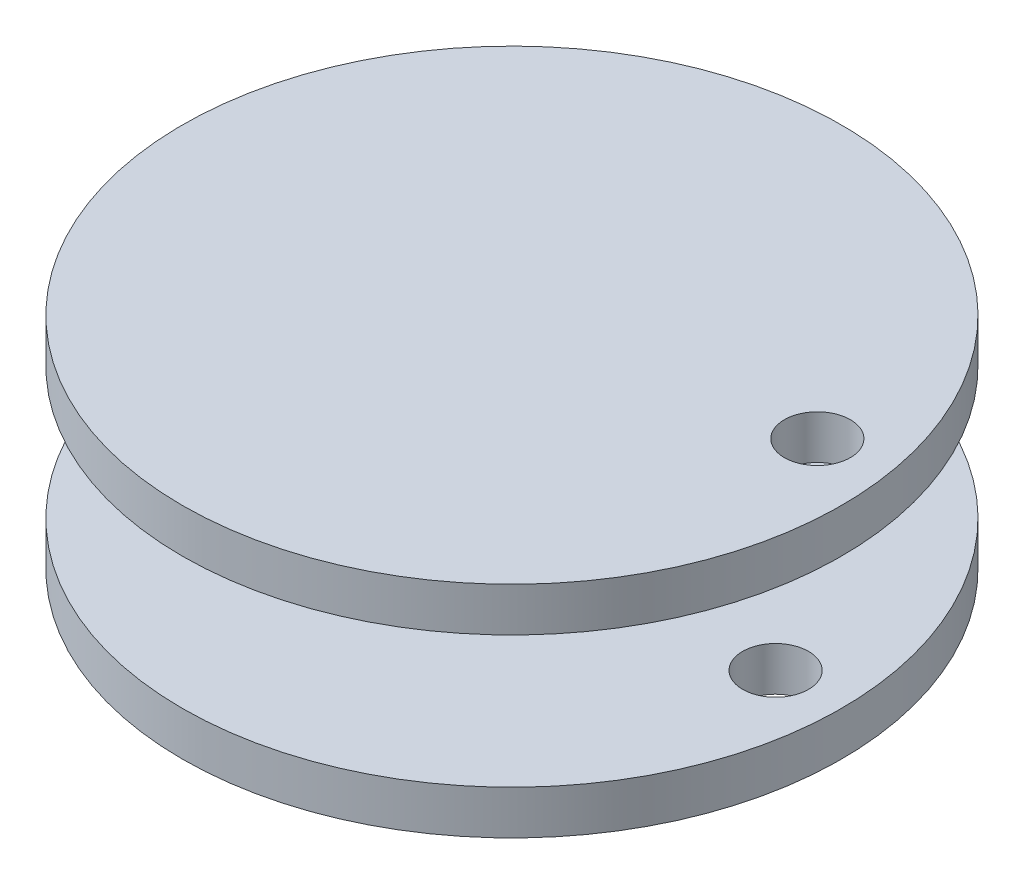
ISO-10303-21;
HEADER;
FILE_DESCRIPTION(('STEP AP214'),'2;1');
FILE_NAME('part.step','',(''),(''),'','','');
FILE_SCHEMA(('AUTOMOTIVE_DESIGN { 1 0 10303 214 1 1 1 1 }'));
ENDSEC;
DATA;
#1=APPLICATION_CONTEXT('core data for automotive mechanical design processes');
#2=APPLICATION_PROTOCOL_DEFINITION('international standard','automotive_design',2000,#1);
#3=PRODUCT_CONTEXT('',#1,'mechanical');
#4=PRODUCT('Part','Part','',(#3));
#5=PRODUCT_RELATED_PRODUCT_CATEGORY('part','',(#4));
#6=PRODUCT_DEFINITION_FORMATION('','',#4);
#7=PRODUCT_DEFINITION_CONTEXT('part definition',#1,'design');
#8=PRODUCT_DEFINITION('design','',#6,#7);
#9=PRODUCT_DEFINITION_SHAPE('','',#8);
#10=(LENGTH_UNIT() NAMED_UNIT(*) SI_UNIT(.MILLI.,.METRE.));
#11=(NAMED_UNIT(*) PLANE_ANGLE_UNIT() SI_UNIT($,.RADIAN.));
#12=(NAMED_UNIT(*) SI_UNIT($,.STERADIAN.) SOLID_ANGLE_UNIT());
#13=UNCERTAINTY_MEASURE_WITH_UNIT(LENGTH_MEASURE(1.E-05),#10,'distance_accuracy_value','');
#14=(GEOMETRIC_REPRESENTATION_CONTEXT(3) GLOBAL_UNCERTAINTY_ASSIGNED_CONTEXT((#13)) GLOBAL_UNIT_ASSIGNED_CONTEXT((#10,
#11,#12)) REPRESENTATION_CONTEXT('',''));
#15=CARTESIAN_POINT('',(0.,0.,0.));
#16=DIRECTION('',(0.,0.,1.));
#17=DIRECTION('',(1.,0.,0.));
#18=AXIS2_PLACEMENT_3D('',#15,#16,#17);
#19=CARTESIAN_POINT('',(0.,10.,0.));
#20=DIRECTION('',(0.,1.,0.));
#21=DIRECTION('',(0.,0.,1.));
#22=AXIS2_PLACEMENT_3D('',#19,#20,#21);
#23=PLANE('',#22);
#24=CARTESIAN_POINT('',(0.,10.,0.));
#25=DIRECTION('',(0.,1.,0.));
#26=DIRECTION('',(0.,0.,1.));
#27=AXIS2_PLACEMENT_3D('',#24,#25,#26);
#28=CIRCLE('',#27,7.5);
#29=CARTESIAN_POINT('',(0.,10.,7.5));
#30=VERTEX_POINT('',#29);
#31=EDGE_CURVE('E66',#30,#30,#28,.T.);
#32=ORIENTED_EDGE('',*,*,#31,.F.);
#33=EDGE_LOOP('',(#32));
#34=FACE_BOUND('',#33,.T.);
#35=CARTESIAN_POINT('',(0.,10.,0.));
#36=DIRECTION('',(0.,1.,0.));
#37=DIRECTION('',(0.,0.,1.));
#38=AXIS2_PLACEMENT_3D('',#35,#36,#37);
#39=CIRCLE('',#38,75.);
#40=CARTESIAN_POINT('',(0.,10.,75.));
#41=VERTEX_POINT('',#40);
#42=EDGE_CURVE('E10',#41,#41,#39,.T.);
#43=ORIENTED_EDGE('',*,*,#42,.T.);
#44=EDGE_LOOP('',(#43));
#45=FACE_BOUND('',#44,.T.);
#46=CARTESIAN_POINT('',(60.,10.,0.));
#47=DIRECTION('',(0.,1.,0.));
#48=DIRECTION('',(0.,0.,1.));
#49=AXIS2_PLACEMENT_3D('',#46,#47,#48);
#50=CIRCLE('',#49,7.50000000000001);
#51=CARTESIAN_POINT('',(60.,10.,7.50000000000001));
#52=VERTEX_POINT('',#51);
#53=EDGE_CURVE('E56',#52,#52,#50,.T.);
#54=ORIENTED_EDGE('',*,*,#53,.F.);
#55=EDGE_LOOP('',(#54));
#56=FACE_BOUND('',#55,.T.);
#57=ADVANCED_FACE('F43',(#34,#45,#56),#23,.T.);
#58=CARTESIAN_POINT('',(0.,0.,0.));
#59=DIRECTION('',(0.,1.,0.));
#60=DIRECTION('',(0.,0.,1.));
#61=AXIS2_PLACEMENT_3D('',#58,#59,#60);
#62=PLANE('',#61);
#63=CARTESIAN_POINT('',(0.,0.,0.));
#64=DIRECTION('',(0.,1.,0.));
#65=DIRECTION('',(0.,0.,1.));
#66=AXIS2_PLACEMENT_3D('',#63,#64,#65);
#67=CIRCLE('',#66,75.);
#68=CARTESIAN_POINT('',(0.,0.,75.));
#69=VERTEX_POINT('',#68);
#70=EDGE_CURVE('E47',#69,#69,#67,.T.);
#71=ORIENTED_EDGE('',*,*,#70,.F.);
#72=EDGE_LOOP('',(#71));
#73=FACE_BOUND('',#72,.T.);
#74=CARTESIAN_POINT('',(60.,0.,0.));
#75=DIRECTION('',(0.,1.,0.));
#76=DIRECTION('',(0.,0.,1.));
#77=AXIS2_PLACEMENT_3D('',#74,#75,#76);
#78=CIRCLE('',#77,7.50000000000001);
#79=CARTESIAN_POINT('',(60.,0.,7.50000000000001));
#80=VERTEX_POINT('',#79);
#81=EDGE_CURVE('E58',#80,#80,#78,.T.);
#82=ORIENTED_EDGE('',*,*,#81,.T.);
#83=EDGE_LOOP('',(#82));
#84=FACE_BOUND('',#83,.T.);
#85=ADVANCED_FACE('F111',(#73,#84),#62,.F.);
#86=CARTESIAN_POINT('',(0.,10.,0.));
#87=DIRECTION('',(0.,-1.,0.));
#88=DIRECTION('',(0.,0.,-1.));
#89=AXIS2_PLACEMENT_3D('',#86,#87,#88);
#90=CYLINDRICAL_SURFACE('',#89,75.);
#91=ORIENTED_EDGE('',*,*,#42,.F.);
#92=EDGE_LOOP('',(#91));
#93=FACE_BOUND('',#92,.T.);
#94=ORIENTED_EDGE('',*,*,#70,.T.);
#95=EDGE_LOOP('',(#94));
#96=FACE_BOUND('',#95,.T.);
#97=ADVANCED_FACE('F45',(#93,#96),#90,.T.);
#98=CARTESIAN_POINT('',(60.,10.,0.));
#99=DIRECTION('',(0.,-1.,0.));
#100=DIRECTION('',(0.,0.,-1.));
#101=AXIS2_PLACEMENT_3D('',#98,#99,#100);
#102=CYLINDRICAL_SURFACE('',#101,7.50000000000001);
#103=ORIENTED_EDGE('',*,*,#53,.T.);
#104=EDGE_LOOP('',(#103));
#105=FACE_BOUND('',#104,.T.);
#106=ORIENTED_EDGE('',*,*,#81,.F.);
#107=EDGE_LOOP('',(#106));
#108=FACE_BOUND('',#107,.T.);
#109=ADVANCED_FACE('F106',(#105,#108),#102,.F.);
#110=CARTESIAN_POINT('',(0.,40.,0.));
#111=DIRECTION('',(0.,-1.,0.));
#112=DIRECTION('',(0.,0.,-1.));
#113=AXIS2_PLACEMENT_3D('',#110,#111,#112);
#114=CYLINDRICAL_SURFACE('',#113,7.5);
#115=CARTESIAN_POINT('',(0.,40.,0.));
#116=DIRECTION('',(0.,1.,0.));
#117=DIRECTION('',(0.,0.,1.));
#118=AXIS2_PLACEMENT_3D('',#115,#116,#117);
#119=CIRCLE('',#118,7.5);
#120=CARTESIAN_POINT('',(0.,40.,7.5));
#121=VERTEX_POINT('',#120);
#122=EDGE_CURVE('E62',#121,#121,#119,.T.);
#123=ORIENTED_EDGE('',*,*,#122,.F.);
#124=EDGE_LOOP('',(#123));
#125=FACE_BOUND('',#124,.T.);
#126=ORIENTED_EDGE('',*,*,#31,.T.);
#127=EDGE_LOOP('',(#126));
#128=FACE_BOUND('',#127,.T.);
#129=ADVANCED_FACE('F96',(#125,#128),#114,.T.);
#130=CARTESIAN_POINT('',(0.,50.,0.));
#131=DIRECTION('',(0.,1.,0.));
#132=DIRECTION('',(0.,0.,1.));
#133=AXIS2_PLACEMENT_3D('',#130,#131,#132);
#134=PLANE('',#133);
#135=CARTESIAN_POINT('',(0.,50.,0.));
#136=DIRECTION('',(0.,1.,0.));
#137=DIRECTION('',(0.,0.,1.));
#138=AXIS2_PLACEMENT_3D('',#135,#136,#137);
#139=CIRCLE('',#138,75.);
#140=CARTESIAN_POINT('',(0.,50.,75.));
#141=VERTEX_POINT('',#140);
#142=EDGE_CURVE('E70',#141,#141,#139,.T.);
#143=ORIENTED_EDGE('',*,*,#142,.T.);
#144=EDGE_LOOP('',(#143));
#145=FACE_BOUND('',#144,.T.);
#146=CARTESIAN_POINT('',(59.0884651807325,50.,-10.4188906600159));
#147=DIRECTION('',(0.,1.,0.));
#148=DIRECTION('',(0.,0.,1.));
#149=AXIS2_PLACEMENT_3D('',#146,#147,#148);
#150=CIRCLE('',#149,7.50000000000001);
#151=CARTESIAN_POINT('',(59.0884651807325,50.,-2.91889066001586));
#152=VERTEX_POINT('',#151);
#153=EDGE_CURVE('E78',#152,#152,#150,.T.);
#154=ORIENTED_EDGE('',*,*,#153,.F.);
#155=EDGE_LOOP('',(#154));
#156=FACE_BOUND('',#155,.T.);
#157=ADVANCED_FACE('F93',(#145,#156),#134,.T.);
#158=CARTESIAN_POINT('',(0.,40.,0.));
#159=DIRECTION('',(0.,1.,0.));
#160=DIRECTION('',(0.,0.,1.));
#161=AXIS2_PLACEMENT_3D('',#158,#159,#160);
#162=PLANE('',#161);
#163=ORIENTED_EDGE('',*,*,#122,.T.);
#164=EDGE_LOOP('',(#163));
#165=FACE_BOUND('',#164,.T.);
#166=CARTESIAN_POINT('',(0.,40.,0.));
#167=DIRECTION('',(0.,1.,0.));
#168=DIRECTION('',(0.,0.,1.));
#169=AXIS2_PLACEMENT_3D('',#166,#167,#168);
#170=CIRCLE('',#169,75.);
#171=CARTESIAN_POINT('',(0.,40.,75.));
#172=VERTEX_POINT('',#171);
#173=EDGE_CURVE('E74',#172,#172,#170,.T.);
#174=ORIENTED_EDGE('',*,*,#173,.F.);
#175=EDGE_LOOP('',(#174));
#176=FACE_BOUND('',#175,.T.);
#177=CARTESIAN_POINT('',(59.0884651807325,40.,-10.4188906600159));
#178=DIRECTION('',(0.,1.,0.));
#179=DIRECTION('',(0.,0.,1.));
#180=AXIS2_PLACEMENT_3D('',#177,#178,#179);
#181=CIRCLE('',#180,7.50000000000001);
#182=CARTESIAN_POINT('',(59.0884651807325,40.,-2.91889066001586));
#183=VERTEX_POINT('',#182);
#184=EDGE_CURVE('E82',#183,#183,#181,.T.);
#185=ORIENTED_EDGE('',*,*,#184,.T.);
#186=EDGE_LOOP('',(#185));
#187=FACE_BOUND('',#186,.T.);
#188=ADVANCED_FACE('F95',(#165,#176,#187),#162,.F.);
#189=CARTESIAN_POINT('',(0.,50.,0.));
#190=DIRECTION('',(0.,-1.,0.));
#191=DIRECTION('',(0.,0.,-1.));
#192=AXIS2_PLACEMENT_3D('',#189,#190,#191);
#193=CYLINDRICAL_SURFACE('',#192,75.);
#194=ORIENTED_EDGE('',*,*,#142,.F.);
#195=EDGE_LOOP('',(#194));
#196=FACE_BOUND('',#195,.T.);
#197=ORIENTED_EDGE('',*,*,#173,.T.);
#198=EDGE_LOOP('',(#197));
#199=FACE_BOUND('',#198,.T.);
#200=ADVANCED_FACE('F103',(#196,#199),#193,.T.);
#201=CARTESIAN_POINT('',(59.0884651807325,50.,-10.4188906600159));
#202=DIRECTION('',(0.,-1.,0.));
#203=DIRECTION('',(0.,0.,-1.));
#204=AXIS2_PLACEMENT_3D('',#201,#202,#203);
#205=CYLINDRICAL_SURFACE('',#204,7.50000000000001);
#206=ORIENTED_EDGE('',*,*,#153,.T.);
#207=EDGE_LOOP('',(#206));
#208=FACE_BOUND('',#207,.T.);
#209=ORIENTED_EDGE('',*,*,#184,.F.);
#210=EDGE_LOOP('',(#209));
#211=FACE_BOUND('',#210,.T.);
#212=ADVANCED_FACE('F90',(#208,#211),#205,.F.);
#213=CLOSED_SHELL('',(#57,#85,#97,#109,#129,#157,#188,#200,#212));
#214=MANIFOLD_SOLID_BREP('B2',#213);
#215=ADVANCED_BREP_SHAPE_REPRESENTATION('',(#18,#214),#14);
#216=SHAPE_DEFINITION_REPRESENTATION(#9,#215);
ENDSEC;
END-ISO-10303-21;
